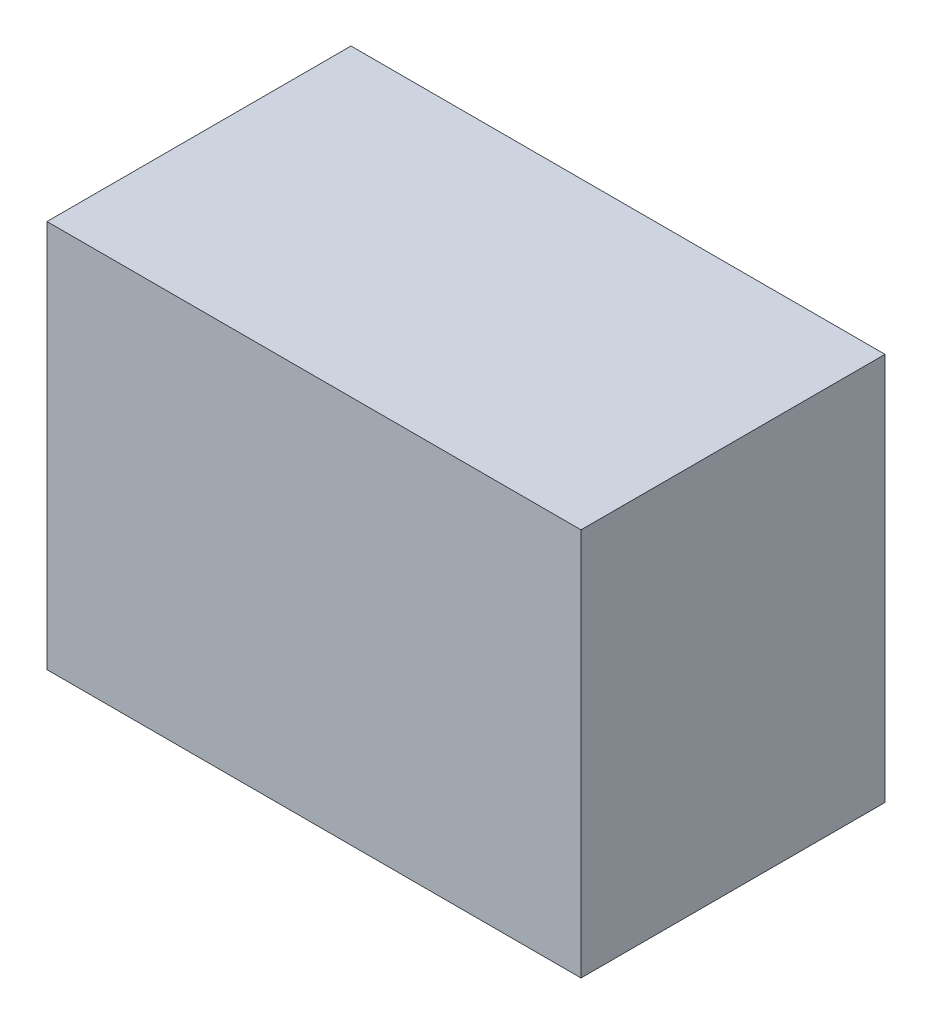
ISO-10303-21;
HEADER;
FILE_DESCRIPTION(('STEP AP214'),'2;1');
FILE_NAME('part.step','',(''),(''),'','','');
FILE_SCHEMA(('AUTOMOTIVE_DESIGN { 1 0 10303 214 1 1 1 1 }'));
ENDSEC;
DATA;
#1=APPLICATION_CONTEXT('core data for automotive mechanical design processes');
#2=APPLICATION_PROTOCOL_DEFINITION('international standard','automotive_design',2000,#1);
#3=PRODUCT_CONTEXT('',#1,'mechanical');
#4=PRODUCT('Part','Part','',(#3));
#5=PRODUCT_RELATED_PRODUCT_CATEGORY('part','',(#4));
#6=PRODUCT_DEFINITION_FORMATION('','',#4);
#7=PRODUCT_DEFINITION_CONTEXT('part definition',#1,'design');
#8=PRODUCT_DEFINITION('design','',#6,#7);
#9=PRODUCT_DEFINITION_SHAPE('','',#8);
#10=(LENGTH_UNIT() NAMED_UNIT(*) SI_UNIT(.MILLI.,.METRE.));
#11=(NAMED_UNIT(*) PLANE_ANGLE_UNIT() SI_UNIT($,.RADIAN.));
#12=(NAMED_UNIT(*) SI_UNIT($,.STERADIAN.) SOLID_ANGLE_UNIT());
#13=UNCERTAINTY_MEASURE_WITH_UNIT(LENGTH_MEASURE(1.E-05),#10,'distance_accuracy_value','');
#14=(GEOMETRIC_REPRESENTATION_CONTEXT(3) GLOBAL_UNCERTAINTY_ASSIGNED_CONTEXT((#13)) GLOBAL_UNIT_ASSIGNED_CONTEXT((#10,
#11,#12)) REPRESENTATION_CONTEXT('',''));
#15=CARTESIAN_POINT('',(0.,0.,0.));
#16=DIRECTION('',(0.,0.,1.));
#17=DIRECTION('',(1.,0.,0.));
#18=AXIS2_PLACEMENT_3D('',#15,#16,#17);
#19=CARTESIAN_POINT('',(26.35,-19.15,30.));
#20=DIRECTION('',(-1.,0.,0.));
#21=DIRECTION('',(0.,0.,1.));
#22=AXIS2_PLACEMENT_3D('',#19,#20,#21);
#23=PLANE('',#22);
#24=DIRECTION('',(0.,1.,0.));
#25=VECTOR('',#24,1.);
#26=CARTESIAN_POINT('',(26.35,-19.15,0.));
#27=LINE('',#26,#25);
#28=CARTESIAN_POINT('',(26.35,-19.15,0.));
#29=VERTEX_POINT('',#28);
#30=CARTESIAN_POINT('',(26.35,19.15,0.));
#31=VERTEX_POINT('',#30);
#32=EDGE_CURVE('E102',#29,#31,#27,.T.);
#33=ORIENTED_EDGE('',*,*,#32,.T.);
#34=DIRECTION('',(0.,0.,-1.));
#35=VECTOR('',#34,1.);
#36=CARTESIAN_POINT('',(26.35,19.15,30.));
#37=LINE('',#36,#35);
#38=CARTESIAN_POINT('',(26.35,19.15,30.));
#39=VERTEX_POINT('',#38);
#40=EDGE_CURVE('E11',#39,#31,#37,.T.);
#41=ORIENTED_EDGE('',*,*,#40,.F.);
#42=DIRECTION('',(0.,1.,0.));
#43=VECTOR('',#42,1.);
#44=CARTESIAN_POINT('',(26.35,-19.15,30.));
#45=LINE('',#44,#43);
#46=CARTESIAN_POINT('',(26.35,-19.15,30.));
#47=VERTEX_POINT('',#46);
#48=EDGE_CURVE('E90',#47,#39,#45,.T.);
#49=ORIENTED_EDGE('',*,*,#48,.F.);
#50=DIRECTION('',(0.,0.,-1.));
#51=VECTOR('',#50,1.);
#52=CARTESIAN_POINT('',(26.35,-19.15,30.));
#53=LINE('',#52,#51);
#54=EDGE_CURVE('E98',#47,#29,#53,.T.);
#55=ORIENTED_EDGE('',*,*,#54,.T.);
#56=EDGE_LOOP('',(#33,#41,#49,#55));
#57=FACE_BOUND('',#56,.T.);
#58=ADVANCED_FACE('F39',(#57),#23,.F.);
#59=CARTESIAN_POINT('',(-26.35,19.15,30.));
#60=DIRECTION('',(0.,-1.,0.));
#61=DIRECTION('',(0.,0.,-1.));
#62=AXIS2_PLACEMENT_3D('',#59,#60,#61);
#63=PLANE('',#62);
#64=DIRECTION('',(-1.,0.,0.));
#65=VECTOR('',#64,1.);
#66=CARTESIAN_POINT('',(-26.35,19.15,0.));
#67=LINE('',#66,#65);
#68=CARTESIAN_POINT('',(-26.35,19.15,0.));
#69=VERTEX_POINT('',#68);
#70=EDGE_CURVE('E94',#31,#69,#67,.T.);
#71=ORIENTED_EDGE('',*,*,#70,.T.);
#72=DIRECTION('',(0.,0.,-1.));
#73=VECTOR('',#72,1.);
#74=CARTESIAN_POINT('',(-26.35,19.15,30.));
#75=LINE('',#74,#73);
#76=CARTESIAN_POINT('',(-26.35,19.15,30.));
#77=VERTEX_POINT('',#76);
#78=EDGE_CURVE('E47',#77,#69,#75,.T.);
#79=ORIENTED_EDGE('',*,*,#78,.F.);
#80=DIRECTION('',(-1.,0.,0.));
#81=VECTOR('',#80,1.);
#82=CARTESIAN_POINT('',(-26.35,19.15,30.));
#83=LINE('',#82,#81);
#84=EDGE_CURVE('E85',#39,#77,#83,.T.);
#85=ORIENTED_EDGE('',*,*,#84,.F.);
#86=ORIENTED_EDGE('',*,*,#40,.T.);
#87=EDGE_LOOP('',(#71,#79,#85,#86));
#88=FACE_BOUND('',#87,.T.);
#89=ADVANCED_FACE('F93',(#88),#63,.F.);
#90=CARTESIAN_POINT('',(-26.35,-19.15,30.));
#91=DIRECTION('',(1.,0.,0.));
#92=DIRECTION('',(0.,0.,-1.));
#93=AXIS2_PLACEMENT_3D('',#90,#91,#92);
#94=PLANE('',#93);
#95=DIRECTION('',(0.,-1.,0.));
#96=VECTOR('',#95,1.);
#97=CARTESIAN_POINT('',(-26.35,-19.15,0.));
#98=LINE('',#97,#96);
#99=CARTESIAN_POINT('',(-26.35,-19.15,0.));
#100=VERTEX_POINT('',#99);
#101=EDGE_CURVE('E72',#69,#100,#98,.T.);
#102=ORIENTED_EDGE('',*,*,#101,.T.);
#103=DIRECTION('',(0.,0.,-1.));
#104=VECTOR('',#103,1.);
#105=CARTESIAN_POINT('',(-26.35,-19.15,30.));
#106=LINE('',#105,#104);
#107=CARTESIAN_POINT('',(-26.35,-19.15,30.));
#108=VERTEX_POINT('',#107);
#109=EDGE_CURVE('E95',#108,#100,#106,.T.);
#110=ORIENTED_EDGE('',*,*,#109,.F.);
#111=DIRECTION('',(0.,-1.,0.));
#112=VECTOR('',#111,1.);
#113=CARTESIAN_POINT('',(-26.35,-19.15,30.));
#114=LINE('',#113,#112);
#115=EDGE_CURVE('E88',#77,#108,#114,.T.);
#116=ORIENTED_EDGE('',*,*,#115,.F.);
#117=ORIENTED_EDGE('',*,*,#78,.T.);
#118=EDGE_LOOP('',(#102,#110,#116,#117));
#119=FACE_BOUND('',#118,.T.);
#120=ADVANCED_FACE('F96',(#119),#94,.F.);
#121=CARTESIAN_POINT('',(-26.35,-19.15,30.));
#122=DIRECTION('',(0.,1.,0.));
#123=DIRECTION('',(0.,0.,1.));
#124=AXIS2_PLACEMENT_3D('',#121,#122,#123);
#125=PLANE('',#124);
#126=DIRECTION('',(1.,0.,0.));
#127=VECTOR('',#126,1.);
#128=CARTESIAN_POINT('',(-26.35,-19.15,0.));
#129=LINE('',#128,#127);
#130=EDGE_CURVE('E78',#100,#29,#129,.T.);
#131=ORIENTED_EDGE('',*,*,#130,.T.);
#132=ORIENTED_EDGE('',*,*,#54,.F.);
#133=DIRECTION('',(1.,0.,0.));
#134=VECTOR('',#133,1.);
#135=CARTESIAN_POINT('',(-26.35,-19.15,30.));
#136=LINE('',#135,#134);
#137=EDGE_CURVE('E55',#108,#47,#136,.T.);
#138=ORIENTED_EDGE('',*,*,#137,.F.);
#139=ORIENTED_EDGE('',*,*,#109,.T.);
#140=EDGE_LOOP('',(#131,#132,#138,#139));
#141=FACE_BOUND('',#140,.T.);
#142=ADVANCED_FACE('F109',(#141),#125,.F.);
#143=CARTESIAN_POINT('',(0.,0.,30.));
#144=DIRECTION('',(0.,0.,-1.));
#145=DIRECTION('',(-1.,0.,0.));
#146=AXIS2_PLACEMENT_3D('',#143,#144,#145);
#147=PLANE('',#146);
#148=ORIENTED_EDGE('',*,*,#48,.T.);
#149=ORIENTED_EDGE('',*,*,#84,.T.);
#150=ORIENTED_EDGE('',*,*,#115,.T.);
#151=ORIENTED_EDGE('',*,*,#137,.T.);
#152=EDGE_LOOP('',(#148,#149,#150,#151));
#153=FACE_BOUND('',#152,.T.);
#154=ADVANCED_FACE('F86',(#153),#147,.F.);
#155=CARTESIAN_POINT('',(0.,0.,0.));
#156=DIRECTION('',(0.,0.,-1.));
#157=DIRECTION('',(-1.,0.,0.));
#158=AXIS2_PLACEMENT_3D('',#155,#156,#157);
#159=PLANE('',#158);
#160=ORIENTED_EDGE('',*,*,#32,.F.);
#161=ORIENTED_EDGE('',*,*,#130,.F.);
#162=ORIENTED_EDGE('',*,*,#101,.F.);
#163=ORIENTED_EDGE('',*,*,#70,.F.);
#164=EDGE_LOOP('',(#160,#161,#162,#163));
#165=FACE_BOUND('',#164,.T.);
#166=ADVANCED_FACE('F112',(#165),#159,.T.);
#167=CLOSED_SHELL('',(#58,#89,#120,#142,#154,#166));
#168=MANIFOLD_SOLID_BREP('B2',#167);
#169=ADVANCED_BREP_SHAPE_REPRESENTATION('',(#18,#168),#14);
#170=SHAPE_DEFINITION_REPRESENTATION(#9,#169);
ENDSEC;
END-ISO-10303-21;
